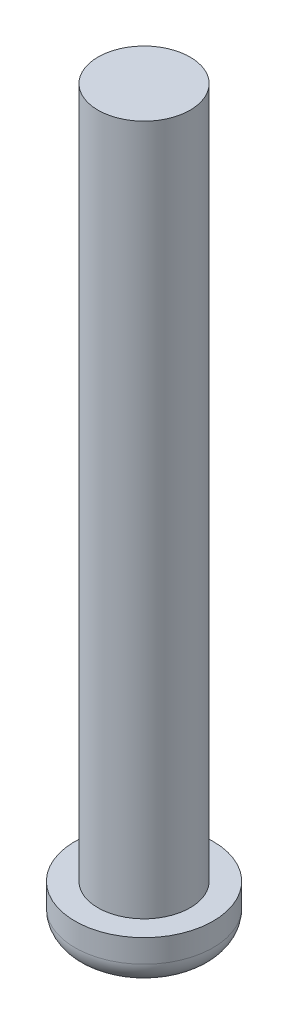
ISO-10303-21;
HEADER;
FILE_DESCRIPTION(('STEP AP214'),'2;1');
FILE_NAME('part.step','',(''),(''),'','','');
FILE_SCHEMA(('AUTOMOTIVE_DESIGN { 1 0 10303 214 1 1 1 1 }'));
ENDSEC;
DATA;
#1=APPLICATION_CONTEXT('core data for automotive mechanical design processes');
#2=APPLICATION_PROTOCOL_DEFINITION('international standard','automotive_design',2000,#1);
#3=PRODUCT_CONTEXT('',#1,'mechanical');
#4=PRODUCT('Part','Part','',(#3));
#5=PRODUCT_RELATED_PRODUCT_CATEGORY('part','',(#4));
#6=PRODUCT_DEFINITION_FORMATION('','',#4);
#7=PRODUCT_DEFINITION_CONTEXT('part definition',#1,'design');
#8=PRODUCT_DEFINITION('design','',#6,#7);
#9=PRODUCT_DEFINITION_SHAPE('','',#8);
#10=(LENGTH_UNIT() NAMED_UNIT(*) SI_UNIT(.MILLI.,.METRE.));
#11=(NAMED_UNIT(*) PLANE_ANGLE_UNIT() SI_UNIT($,.RADIAN.));
#12=(NAMED_UNIT(*) SI_UNIT($,.STERADIAN.) SOLID_ANGLE_UNIT());
#13=UNCERTAINTY_MEASURE_WITH_UNIT(LENGTH_MEASURE(1.E-05),#10,'distance_accuracy_value','');
#14=(GEOMETRIC_REPRESENTATION_CONTEXT(3) GLOBAL_UNCERTAINTY_ASSIGNED_CONTEXT((#13)) GLOBAL_UNIT_ASSIGNED_CONTEXT((#10,
#11,#12)) REPRESENTATION_CONTEXT('',''));
#15=CARTESIAN_POINT('',(0.,0.,0.));
#16=DIRECTION('',(0.,0.,1.));
#17=DIRECTION('',(1.,0.,0.));
#18=AXIS2_PLACEMENT_3D('',#15,#16,#17);
#19=CARTESIAN_POINT('',(0.,60.,0.));
#20=DIRECTION('',(0.,-1.,0.));
#21=DIRECTION('',(0.,0.,-1.));
#22=AXIS2_PLACEMENT_3D('',#19,#20,#21);
#23=CYLINDRICAL_SURFACE('',#22,4.);
#24=CARTESIAN_POINT('',(0.,60.,0.));
#25=DIRECTION('',(0.,1.,0.));
#26=DIRECTION('',(0.,0.,1.));
#27=AXIS2_PLACEMENT_3D('',#24,#25,#26);
#28=CIRCLE('',#27,4.);
#29=CARTESIAN_POINT('',(0.,60.,4.));
#30=VERTEX_POINT('',#29);
#31=EDGE_CURVE('E46',#30,#30,#28,.T.);
#32=ORIENTED_EDGE('',*,*,#31,.F.);
#33=EDGE_LOOP('',(#32));
#34=FACE_BOUND('',#33,.T.);
#35=CARTESIAN_POINT('',(0.,0.,0.));
#36=DIRECTION('',(0.,1.,0.));
#37=DIRECTION('',(0.,0.,1.));
#38=AXIS2_PLACEMENT_3D('',#35,#36,#37);
#39=CIRCLE('',#38,4.);
#40=CARTESIAN_POINT('',(0.,0.,4.));
#41=VERTEX_POINT('',#40);
#42=EDGE_CURVE('E50',#41,#41,#39,.T.);
#43=ORIENTED_EDGE('',*,*,#42,.T.);
#44=EDGE_LOOP('',(#43));
#45=FACE_BOUND('',#44,.T.);
#46=ADVANCED_FACE('F35',(#34,#45),#23,.T.);
#47=CARTESIAN_POINT('',(0.,60.,0.));
#48=DIRECTION('',(0.,1.,0.));
#49=DIRECTION('',(0.,0.,1.));
#50=AXIS2_PLACEMENT_3D('',#47,#48,#49);
#51=PLANE('',#50);
#52=ORIENTED_EDGE('',*,*,#31,.T.);
#53=EDGE_LOOP('',(#52));
#54=FACE_BOUND('',#53,.T.);
#55=ADVANCED_FACE('F75',(#54),#51,.T.);
#56=CARTESIAN_POINT('',(0.,-4.,0.));
#57=DIRECTION('',(0.,1.,0.));
#58=DIRECTION('',(0.,0.,1.));
#59=AXIS2_PLACEMENT_3D('',#56,#57,#58);
#60=CYLINDRICAL_SURFACE('',#59,6.);
#61=CARTESIAN_POINT('',(0.,-2.,0.));
#62=DIRECTION('',(0.,-1.,0.));
#63=DIRECTION('',(0.,0.,-1.));
#64=AXIS2_PLACEMENT_3D('',#61,#62,#63);
#65=CIRCLE('',#64,6.);
#66=CARTESIAN_POINT('',(0.,-2.,-6.));
#67=VERTEX_POINT('',#66);
#68=EDGE_CURVE('E10',#67,#67,#65,.F.);
#69=ORIENTED_EDGE('',*,*,#68,.T.);
#70=EDGE_LOOP('',(#69));
#71=FACE_BOUND('',#70,.T.);
#72=CARTESIAN_POINT('',(0.,0.,0.));
#73=DIRECTION('',(0.,-1.,0.));
#74=DIRECTION('',(0.,0.,-1.));
#75=AXIS2_PLACEMENT_3D('',#72,#73,#74);
#76=CIRCLE('',#75,6.);
#77=CARTESIAN_POINT('',(0.,0.,-6.));
#78=VERTEX_POINT('',#77);
#79=EDGE_CURVE('E54',#78,#78,#76,.T.);
#80=ORIENTED_EDGE('',*,*,#79,.T.);
#81=EDGE_LOOP('',(#80));
#82=FACE_BOUND('',#81,.T.);
#83=ADVANCED_FACE('F59',(#71,#82),#60,.T.);
#84=CARTESIAN_POINT('',(0.,-4.,0.));
#85=DIRECTION('',(0.,-1.,0.));
#86=DIRECTION('',(0.,0.,-1.));
#87=AXIS2_PLACEMENT_3D('',#84,#85,#86);
#88=PLANE('',#87);
#89=CARTESIAN_POINT('',(0.,-4.,0.));
#90=DIRECTION('',(0.,-1.,0.));
#91=DIRECTION('',(0.,0.,-1.));
#92=AXIS2_PLACEMENT_3D('',#89,#90,#91);
#93=CIRCLE('',#92,4.);
#94=CARTESIAN_POINT('',(0.,-4.,-4.));
#95=VERTEX_POINT('',#94);
#96=EDGE_CURVE('E42',#95,#95,#93,.T.);
#97=ORIENTED_EDGE('',*,*,#96,.T.);
#98=EDGE_LOOP('',(#97));
#99=FACE_BOUND('',#98,.T.);
#100=ADVANCED_FACE('F63',(#99),#88,.T.);
#101=CARTESIAN_POINT('',(0.,0.,0.));
#102=DIRECTION('',(0.,-1.,0.));
#103=DIRECTION('',(0.,0.,-1.));
#104=AXIS2_PLACEMENT_3D('',#101,#102,#103);
#105=PLANE('',#104);
#106=ORIENTED_EDGE('',*,*,#42,.F.);
#107=EDGE_LOOP('',(#106));
#108=FACE_BOUND('',#107,.T.);
#109=ORIENTED_EDGE('',*,*,#79,.F.);
#110=EDGE_LOOP('',(#109));
#111=FACE_BOUND('',#110,.T.);
#112=ADVANCED_FACE('F61',(#108,#111),#105,.F.);
#113=CARTESIAN_POINT('',(0.,-2.,0.));
#114=DIRECTION('',(0.,-1.,0.));
#115=DIRECTION('',(0.,0.,-1.));
#116=AXIS2_PLACEMENT_3D('',#113,#114,#115);
#117=TOROIDAL_SURFACE('',#116,4.,2.);
#118=ORIENTED_EDGE('',*,*,#68,.F.);
#119=EDGE_LOOP('',(#118));
#120=FACE_BOUND('',#119,.T.);
#121=ORIENTED_EDGE('',*,*,#96,.F.);
#122=EDGE_LOOP('',(#121));
#123=FACE_BOUND('',#122,.T.);
#124=ADVANCED_FACE('F37',(#120,#123),#117,.T.);
#125=CLOSED_SHELL('',(#46,#55,#83,#100,#112,#124));
#126=MANIFOLD_SOLID_BREP('B2',#125);
#127=ADVANCED_BREP_SHAPE_REPRESENTATION('',(#18,#126),#14);
#128=SHAPE_DEFINITION_REPRESENTATION(#9,#127);
ENDSEC;
END-ISO-10303-21;
